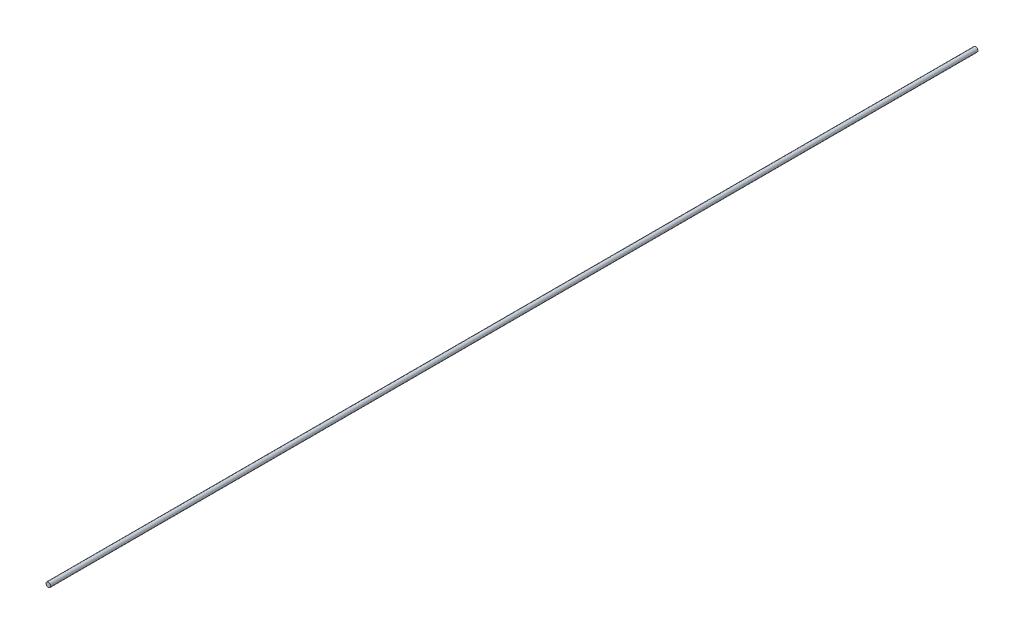
ISO-10303-21;
HEADER;
FILE_DESCRIPTION(('STEP AP214'),'2;1');
FILE_NAME('part.step','',(''),(''),'','','');
FILE_SCHEMA(('AUTOMOTIVE_DESIGN { 1 0 10303 214 1 1 1 1 }'));
ENDSEC;
DATA;
#1=APPLICATION_CONTEXT('core data for automotive mechanical design processes');
#2=APPLICATION_PROTOCOL_DEFINITION('international standard','automotive_design',2000,#1);
#3=PRODUCT_CONTEXT('',#1,'mechanical');
#4=PRODUCT('Part','Part','',(#3));
#5=PRODUCT_RELATED_PRODUCT_CATEGORY('part','',(#4));
#6=PRODUCT_DEFINITION_FORMATION('','',#4);
#7=PRODUCT_DEFINITION_CONTEXT('part definition',#1,'design');
#8=PRODUCT_DEFINITION('design','',#6,#7);
#9=PRODUCT_DEFINITION_SHAPE('','',#8);
#10=(LENGTH_UNIT() NAMED_UNIT(*) SI_UNIT(.MILLI.,.METRE.));
#11=(NAMED_UNIT(*) PLANE_ANGLE_UNIT() SI_UNIT($,.RADIAN.));
#12=(NAMED_UNIT(*) SI_UNIT($,.STERADIAN.) SOLID_ANGLE_UNIT());
#13=UNCERTAINTY_MEASURE_WITH_UNIT(LENGTH_MEASURE(1.E-05),#10,'distance_accuracy_value','');
#14=(GEOMETRIC_REPRESENTATION_CONTEXT(3) GLOBAL_UNCERTAINTY_ASSIGNED_CONTEXT((#13)) GLOBAL_UNIT_ASSIGNED_CONTEXT((#10,
#11,#12)) REPRESENTATION_CONTEXT('',''));
#15=CARTESIAN_POINT('',(0.,0.,0.));
#16=DIRECTION('',(0.,0.,1.));
#17=DIRECTION('',(1.,0.,0.));
#18=AXIS2_PLACEMENT_3D('',#15,#16,#17);
#19=CARTESIAN_POINT('',(0.,0.,600.));
#20=DIRECTION('',(0.,0.,-1.));
#21=DIRECTION('',(-1.,0.,0.));
#22=AXIS2_PLACEMENT_3D('',#19,#20,#21);
#23=CYLINDRICAL_SURFACE('',#22,1.5);
#24=CARTESIAN_POINT('',(0.,0.,600.));
#25=DIRECTION('',(0.,0.,1.));
#26=DIRECTION('',(1.,0.,0.));
#27=AXIS2_PLACEMENT_3D('',#24,#25,#26);
#28=CIRCLE('',#27,1.5);
#29=CARTESIAN_POINT('',(1.5,0.,600.));
#30=VERTEX_POINT('',#29);
#31=EDGE_CURVE('E10',#30,#30,#28,.T.);
#32=ORIENTED_EDGE('',*,*,#31,.F.);
#33=EDGE_LOOP('',(#32));
#34=FACE_BOUND('',#33,.T.);
#35=CARTESIAN_POINT('',(0.,0.,0.));
#36=DIRECTION('',(0.,0.,1.));
#37=DIRECTION('',(1.,0.,0.));
#38=AXIS2_PLACEMENT_3D('',#35,#36,#37);
#39=CIRCLE('',#38,1.5);
#40=CARTESIAN_POINT('',(1.5,0.,0.));
#41=VERTEX_POINT('',#40);
#42=EDGE_CURVE('E33',#41,#41,#39,.T.);
#43=ORIENTED_EDGE('',*,*,#42,.T.);
#44=EDGE_LOOP('',(#43));
#45=FACE_BOUND('',#44,.T.);
#46=ADVANCED_FACE('F30',(#34,#45),#23,.T.);
#47=CARTESIAN_POINT('',(0.,0.,600.));
#48=DIRECTION('',(0.,0.,1.));
#49=DIRECTION('',(1.,0.,0.));
#50=AXIS2_PLACEMENT_3D('',#47,#48,#49);
#51=PLANE('',#50);
#52=ORIENTED_EDGE('',*,*,#31,.T.);
#53=EDGE_LOOP('',(#52));
#54=FACE_BOUND('',#53,.T.);
#55=ADVANCED_FACE('F45',(#54),#51,.T.);
#56=CARTESIAN_POINT('',(0.,0.,0.));
#57=DIRECTION('',(0.,0.,1.));
#58=DIRECTION('',(1.,0.,0.));
#59=AXIS2_PLACEMENT_3D('',#56,#57,#58);
#60=PLANE('',#59);
#61=ORIENTED_EDGE('',*,*,#42,.F.);
#62=EDGE_LOOP('',(#61));
#63=FACE_BOUND('',#62,.T.);
#64=ADVANCED_FACE('F43',(#63),#60,.F.);
#65=CLOSED_SHELL('',(#46,#55,#64));
#66=MANIFOLD_SOLID_BREP('B2',#65);
#67=ADVANCED_BREP_SHAPE_REPRESENTATION('',(#18,#66),#14);
#68=SHAPE_DEFINITION_REPRESENTATION(#9,#67);
ENDSEC;
END-ISO-10303-21;
